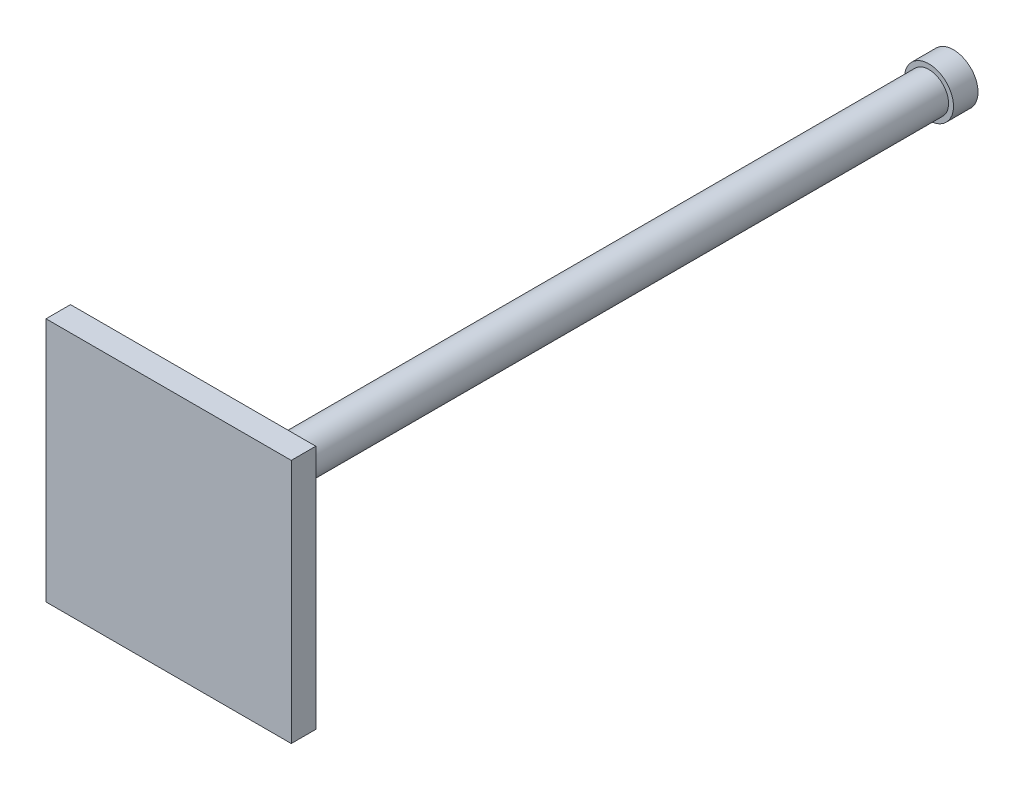
ISO-10303-21;
HEADER;
FILE_DESCRIPTION(('STEP AP214'),'2;1');
FILE_NAME('part.step','',(''),(''),'','','');
FILE_SCHEMA(('AUTOMOTIVE_DESIGN { 1 0 10303 214 1 1 1 1 }'));
ENDSEC;
DATA;
#1=APPLICATION_CONTEXT('core data for automotive mechanical design processes');
#2=APPLICATION_PROTOCOL_DEFINITION('international standard','automotive_design',2000,#1);
#3=PRODUCT_CONTEXT('',#1,'mechanical');
#4=PRODUCT('Part','Part','',(#3));
#5=PRODUCT_RELATED_PRODUCT_CATEGORY('part','',(#4));
#6=PRODUCT_DEFINITION_FORMATION('','',#4);
#7=PRODUCT_DEFINITION_CONTEXT('part definition',#1,'design');
#8=PRODUCT_DEFINITION('design','',#6,#7);
#9=PRODUCT_DEFINITION_SHAPE('','',#8);
#10=(LENGTH_UNIT() NAMED_UNIT(*) SI_UNIT(.MILLI.,.METRE.));
#11=(NAMED_UNIT(*) PLANE_ANGLE_UNIT() SI_UNIT($,.RADIAN.));
#12=(NAMED_UNIT(*) SI_UNIT($,.STERADIAN.) SOLID_ANGLE_UNIT());
#13=UNCERTAINTY_MEASURE_WITH_UNIT(LENGTH_MEASURE(1.E-05),#10,'distance_accuracy_value','');
#14=(GEOMETRIC_REPRESENTATION_CONTEXT(3) GLOBAL_UNCERTAINTY_ASSIGNED_CONTEXT((#13)) GLOBAL_UNIT_ASSIGNED_CONTEXT((#10,
#11,#12)) REPRESENTATION_CONTEXT('',''));
#15=CARTESIAN_POINT('',(0.,0.,0.));
#16=DIRECTION('',(0.,0.,1.));
#17=DIRECTION('',(1.,0.,0.));
#18=AXIS2_PLACEMENT_3D('',#15,#16,#17);
#19=CARTESIAN_POINT('',(0.,0.,-300.));
#20=DIRECTION('',(0.,0.,1.));
#21=DIRECTION('',(1.,0.,0.));
#22=AXIS2_PLACEMENT_3D('',#19,#20,#21);
#23=PLANE('',#22);
#24=CARTESIAN_POINT('',(0.,0.,-300.));
#25=DIRECTION('',(0.,0.,1.));
#26=DIRECTION('',(1.,0.,0.));
#27=AXIS2_PLACEMENT_3D('',#24,#25,#26);
#28=CIRCLE('',#27,10.);
#29=CARTESIAN_POINT('',(10.,0.,-300.));
#30=VERTEX_POINT('',#29);
#31=EDGE_CURVE('E10',#30,#30,#28,.T.);
#32=ORIENTED_EDGE('',*,*,#31,.T.);
#33=EDGE_LOOP('',(#32));
#34=FACE_BOUND('',#33,.T.);
#35=CARTESIAN_POINT('',(0.,0.,-300.));
#36=DIRECTION('',(0.,0.,1.));
#37=DIRECTION('',(1.,0.,0.));
#38=AXIS2_PLACEMENT_3D('',#35,#36,#37);
#39=CIRCLE('',#38,8.);
#40=CARTESIAN_POINT('',(8.,0.,-300.));
#41=VERTEX_POINT('',#40);
#42=EDGE_CURVE('E128',#41,#41,#39,.T.);
#43=ORIENTED_EDGE('',*,*,#42,.F.);
#44=EDGE_LOOP('',(#43));
#45=FACE_BOUND('',#44,.T.);
#46=ADVANCED_FACE('F16',(#34,#45),#23,.T.);
#47=CARTESIAN_POINT('',(0.,0.,-310.));
#48=DIRECTION('',(0.,0.,1.));
#49=DIRECTION('',(1.,0.,0.));
#50=AXIS2_PLACEMENT_3D('',#47,#48,#49);
#51=PLANE('',#50);
#52=CARTESIAN_POINT('',(0.,0.,-310.));
#53=DIRECTION('',(0.,0.,1.));
#54=DIRECTION('',(1.,0.,0.));
#55=AXIS2_PLACEMENT_3D('',#52,#53,#54);
#56=CIRCLE('',#55,10.);
#57=CARTESIAN_POINT('',(10.,0.,-310.));
#58=VERTEX_POINT('',#57);
#59=EDGE_CURVE('E27',#58,#58,#56,.T.);
#60=ORIENTED_EDGE('',*,*,#59,.F.);
#61=EDGE_LOOP('',(#60));
#62=FACE_BOUND('',#61,.T.);
#63=ADVANCED_FACE('F18',(#62),#51,.F.);
#64=CARTESIAN_POINT('',(0.,0.,-310.));
#65=DIRECTION('',(0.,0.,1.));
#66=DIRECTION('',(1.,0.,0.));
#67=AXIS2_PLACEMENT_3D('',#64,#65,#66);
#68=CYLINDRICAL_SURFACE('',#67,10.);
#69=ORIENTED_EDGE('',*,*,#31,.F.);
#70=EDGE_LOOP('',(#69));
#71=FACE_BOUND('',#70,.T.);
#72=ORIENTED_EDGE('',*,*,#59,.T.);
#73=EDGE_LOOP('',(#72));
#74=FACE_BOUND('',#73,.T.);
#75=ADVANCED_FACE('F161',(#71,#74),#68,.T.);
#76=CARTESIAN_POINT('',(0.,0.,-300.));
#77=DIRECTION('',(0.,0.,1.));
#78=DIRECTION('',(1.,0.,0.));
#79=AXIS2_PLACEMENT_3D('',#76,#77,#78);
#80=CYLINDRICAL_SURFACE('',#79,8.);
#81=CARTESIAN_POINT('',(0.,0.,0.));
#82=DIRECTION('',(0.,0.,1.));
#83=DIRECTION('',(1.,0.,0.));
#84=AXIS2_PLACEMENT_3D('',#81,#82,#83);
#85=CIRCLE('',#84,8.);
#86=CARTESIAN_POINT('',(8.,0.,0.));
#87=VERTEX_POINT('',#86);
#88=EDGE_CURVE('E52',#87,#87,#85,.T.);
#89=ORIENTED_EDGE('',*,*,#88,.F.);
#90=EDGE_LOOP('',(#89));
#91=FACE_BOUND('',#90,.T.);
#92=ORIENTED_EDGE('',*,*,#42,.T.);
#93=EDGE_LOOP('',(#92));
#94=FACE_BOUND('',#93,.T.);
#95=ADVANCED_FACE('F169',(#91,#94),#80,.T.);
#96=CARTESIAN_POINT('',(0.,0.,0.));
#97=DIRECTION('',(0.,0.,1.));
#98=DIRECTION('',(1.,0.,0.));
#99=AXIS2_PLACEMENT_3D('',#96,#97,#98);
#100=PLANE('',#99);
#101=DIRECTION('',(-1.,0.,0.));
#102=VECTOR('',#101,1.);
#103=CARTESIAN_POINT('',(50.,50.,0.));
#104=LINE('',#103,#102);
#105=CARTESIAN_POINT('',(50.,50.,0.));
#106=VERTEX_POINT('',#105);
#107=CARTESIAN_POINT('',(-50.,50.,0.));
#108=VERTEX_POINT('',#107);
#109=EDGE_CURVE('E112',#106,#108,#104,.T.);
#110=ORIENTED_EDGE('',*,*,#109,.F.);
#111=DIRECTION('',(0.,1.,0.));
#112=VECTOR('',#111,1.);
#113=CARTESIAN_POINT('',(50.,-50.,0.));
#114=LINE('',#113,#112);
#115=CARTESIAN_POINT('',(50.,-50.,0.));
#116=VERTEX_POINT('',#115);
#117=EDGE_CURVE('E98',#116,#106,#114,.T.);
#118=ORIENTED_EDGE('',*,*,#117,.F.);
#119=DIRECTION('',(1.,0.,0.));
#120=VECTOR('',#119,1.);
#121=CARTESIAN_POINT('',(-50.,-50.,0.));
#122=LINE('',#121,#120);
#123=CARTESIAN_POINT('',(-50.,-50.,0.));
#124=VERTEX_POINT('',#123);
#125=EDGE_CURVE('E139',#124,#116,#122,.T.);
#126=ORIENTED_EDGE('',*,*,#125,.F.);
#127=DIRECTION('',(0.,-1.,0.));
#128=VECTOR('',#127,1.);
#129=CARTESIAN_POINT('',(-50.,50.,0.));
#130=LINE('',#129,#128);
#131=EDGE_CURVE('E95',#108,#124,#130,.T.);
#132=ORIENTED_EDGE('',*,*,#131,.F.);
#133=EDGE_LOOP('',(#110,#118,#126,#132));
#134=FACE_BOUND('',#133,.T.);
#135=ORIENTED_EDGE('',*,*,#88,.T.);
#136=EDGE_LOOP('',(#135));
#137=FACE_BOUND('',#136,.T.);
#138=ADVANCED_FACE('F116',(#134,#137),#100,.F.);
#139=CARTESIAN_POINT('',(0.,0.,10.));
#140=DIRECTION('',(0.,0.,1.));
#141=DIRECTION('',(1.,0.,0.));
#142=AXIS2_PLACEMENT_3D('',#139,#140,#141);
#143=PLANE('',#142);
#144=DIRECTION('',(-1.,0.,0.));
#145=VECTOR('',#144,1.);
#146=CARTESIAN_POINT('',(50.,50.,10.));
#147=LINE('',#146,#145);
#148=CARTESIAN_POINT('',(50.,50.,10.));
#149=VERTEX_POINT('',#148);
#150=CARTESIAN_POINT('',(-50.,50.,10.));
#151=VERTEX_POINT('',#150);
#152=EDGE_CURVE('E113',#149,#151,#147,.T.);
#153=ORIENTED_EDGE('',*,*,#152,.T.);
#154=DIRECTION('',(0.,-1.,0.));
#155=VECTOR('',#154,1.);
#156=CARTESIAN_POINT('',(-50.,50.,10.));
#157=LINE('',#156,#155);
#158=CARTESIAN_POINT('',(-50.,-50.,10.));
#159=VERTEX_POINT('',#158);
#160=EDGE_CURVE('E81',#151,#159,#157,.T.);
#161=ORIENTED_EDGE('',*,*,#160,.T.);
#162=DIRECTION('',(1.,0.,0.));
#163=VECTOR('',#162,1.);
#164=CARTESIAN_POINT('',(-50.,-50.,10.));
#165=LINE('',#164,#163);
#166=CARTESIAN_POINT('',(50.,-50.,10.));
#167=VERTEX_POINT('',#166);
#168=EDGE_CURVE('E20',#159,#167,#165,.T.);
#169=ORIENTED_EDGE('',*,*,#168,.T.);
#170=DIRECTION('',(0.,1.,0.));
#171=VECTOR('',#170,1.);
#172=CARTESIAN_POINT('',(50.,-50.,10.));
#173=LINE('',#172,#171);
#174=EDGE_CURVE('E64',#167,#149,#173,.T.);
#175=ORIENTED_EDGE('',*,*,#174,.T.);
#176=EDGE_LOOP('',(#153,#161,#169,#175));
#177=FACE_BOUND('',#176,.T.);
#178=ADVANCED_FACE('F182',(#177),#143,.T.);
#179=CARTESIAN_POINT('',(50.,-50.,10.));
#180=DIRECTION('',(-1.,0.,0.));
#181=DIRECTION('',(0.,0.,1.));
#182=AXIS2_PLACEMENT_3D('',#179,#180,#181);
#183=PLANE('',#182);
#184=ORIENTED_EDGE('',*,*,#117,.T.);
#185=DIRECTION('',(0.,0.,-1.));
#186=VECTOR('',#185,1.);
#187=CARTESIAN_POINT('',(50.,50.,10.));
#188=LINE('',#187,#186);
#189=EDGE_CURVE('E101',#149,#106,#188,.T.);
#190=ORIENTED_EDGE('',*,*,#189,.F.);
#191=ORIENTED_EDGE('',*,*,#174,.F.);
#192=DIRECTION('',(0.,0.,-1.));
#193=VECTOR('',#192,1.);
#194=CARTESIAN_POINT('',(50.,-50.,10.));
#195=LINE('',#194,#193);
#196=EDGE_CURVE('E104',#167,#116,#195,.T.);
#197=ORIENTED_EDGE('',*,*,#196,.T.);
#198=EDGE_LOOP('',(#184,#190,#191,#197));
#199=FACE_BOUND('',#198,.T.);
#200=ADVANCED_FACE('F100',(#199),#183,.F.);
#201=CARTESIAN_POINT('',(-50.,-50.,10.));
#202=DIRECTION('',(0.,1.,0.));
#203=DIRECTION('',(1.,0.,0.));
#204=AXIS2_PLACEMENT_3D('',#201,#202,#203);
#205=PLANE('',#204);
#206=ORIENTED_EDGE('',*,*,#125,.T.);
#207=ORIENTED_EDGE('',*,*,#196,.F.);
#208=ORIENTED_EDGE('',*,*,#168,.F.);
#209=DIRECTION('',(0.,0.,-1.));
#210=VECTOR('',#209,1.);
#211=CARTESIAN_POINT('',(-50.,-50.,10.));
#212=LINE('',#211,#210);
#213=EDGE_CURVE('E141',#159,#124,#212,.T.);
#214=ORIENTED_EDGE('',*,*,#213,.T.);
#215=EDGE_LOOP('',(#206,#207,#208,#214));
#216=FACE_BOUND('',#215,.T.);
#217=ADVANCED_FACE('F185',(#216),#205,.F.);
#218=CARTESIAN_POINT('',(-50.,50.,10.));
#219=DIRECTION('',(1.,0.,0.));
#220=DIRECTION('',(0.,1.,0.));
#221=AXIS2_PLACEMENT_3D('',#218,#219,#220);
#222=PLANE('',#221);
#223=ORIENTED_EDGE('',*,*,#131,.T.);
#224=ORIENTED_EDGE('',*,*,#213,.F.);
#225=ORIENTED_EDGE('',*,*,#160,.F.);
#226=DIRECTION('',(0.,0.,-1.));
#227=VECTOR('',#226,1.);
#228=CARTESIAN_POINT('',(-50.,50.,10.));
#229=LINE('',#228,#227);
#230=EDGE_CURVE('E118',#151,#108,#229,.T.);
#231=ORIENTED_EDGE('',*,*,#230,.T.);
#232=EDGE_LOOP('',(#223,#224,#225,#231));
#233=FACE_BOUND('',#232,.T.);
#234=ADVANCED_FACE('F179',(#233),#222,.F.);
#235=CARTESIAN_POINT('',(50.,50.,10.));
#236=DIRECTION('',(0.,-1.,0.));
#237=DIRECTION('',(0.,0.,-1.));
#238=AXIS2_PLACEMENT_3D('',#235,#236,#237);
#239=PLANE('',#238);
#240=ORIENTED_EDGE('',*,*,#109,.T.);
#241=ORIENTED_EDGE('',*,*,#230,.F.);
#242=ORIENTED_EDGE('',*,*,#152,.F.);
#243=ORIENTED_EDGE('',*,*,#189,.T.);
#244=EDGE_LOOP('',(#240,#241,#242,#243));
#245=FACE_BOUND('',#244,.T.);
#246=ADVANCED_FACE('F110',(#245),#239,.F.);
#247=CLOSED_SHELL('',(#46,#63,#75,#95,#138,#178,#200,#217,#234,#246));
#248=MANIFOLD_SOLID_BREP('B1',#247);
#249=ADVANCED_BREP_SHAPE_REPRESENTATION('',(#18,#248),#14);
#250=SHAPE_DEFINITION_REPRESENTATION(#9,#249);
ENDSEC;
END-ISO-10303-21;
